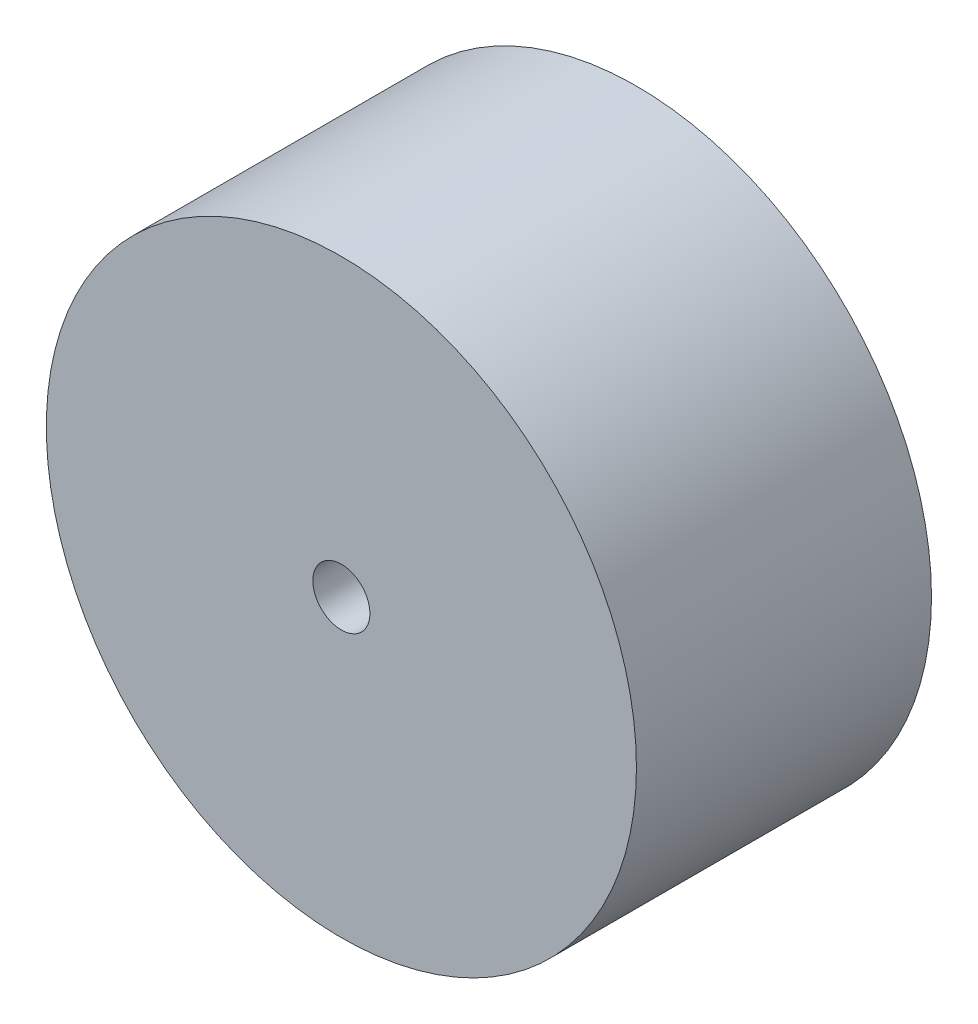
ISO-10303-21;
HEADER;
FILE_DESCRIPTION(('STEP AP214'),'2;1');
FILE_NAME('part.step','',(''),(''),'','','');
FILE_SCHEMA(('AUTOMOTIVE_DESIGN { 1 0 10303 214 1 1 1 1 }'));
ENDSEC;
DATA;
#1=APPLICATION_CONTEXT('core data for automotive mechanical design processes');
#2=APPLICATION_PROTOCOL_DEFINITION('international standard','automotive_design',2000,#1);
#3=PRODUCT_CONTEXT('',#1,'mechanical');
#4=PRODUCT('Part','Part','',(#3));
#5=PRODUCT_RELATED_PRODUCT_CATEGORY('part','',(#4));
#6=PRODUCT_DEFINITION_FORMATION('','',#4);
#7=PRODUCT_DEFINITION_CONTEXT('part definition',#1,'design');
#8=PRODUCT_DEFINITION('design','',#6,#7);
#9=PRODUCT_DEFINITION_SHAPE('','',#8);
#10=(LENGTH_UNIT() NAMED_UNIT(*) SI_UNIT(.MILLI.,.METRE.));
#11=(NAMED_UNIT(*) PLANE_ANGLE_UNIT() SI_UNIT($,.RADIAN.));
#12=(NAMED_UNIT(*) SI_UNIT($,.STERADIAN.) SOLID_ANGLE_UNIT());
#13=UNCERTAINTY_MEASURE_WITH_UNIT(LENGTH_MEASURE(1.E-05),#10,'distance_accuracy_value','');
#14=(GEOMETRIC_REPRESENTATION_CONTEXT(3) GLOBAL_UNCERTAINTY_ASSIGNED_CONTEXT((#13)) GLOBAL_UNIT_ASSIGNED_CONTEXT((#10,
#11,#12)) REPRESENTATION_CONTEXT('',''));
#15=CARTESIAN_POINT('',(0.,0.,0.));
#16=DIRECTION('',(0.,0.,1.));
#17=DIRECTION('',(1.,0.,0.));
#18=AXIS2_PLACEMENT_3D('',#15,#16,#17);
#19=CARTESIAN_POINT('',(0.,0.,15.));
#20=DIRECTION('',(0.,0.,1.));
#21=DIRECTION('',(1.,0.,0.));
#22=AXIS2_PLACEMENT_3D('',#19,#20,#21);
#23=PLANE('',#22);
#24=CARTESIAN_POINT('',(0.,0.,15.));
#25=DIRECTION('',(0.,0.,1.));
#26=DIRECTION('',(1.,0.,0.));
#27=AXIS2_PLACEMENT_3D('',#24,#25,#26);
#28=CIRCLE('',#27,15.);
#29=CARTESIAN_POINT('',(15.,0.,15.));
#30=VERTEX_POINT('',#29);
#31=EDGE_CURVE('E10',#30,#30,#28,.T.);
#32=ORIENTED_EDGE('',*,*,#31,.T.);
#33=EDGE_LOOP('',(#32));
#34=FACE_BOUND('',#33,.T.);
#35=CARTESIAN_POINT('',(0.,0.,15.));
#36=DIRECTION('',(0.,0.,1.));
#37=DIRECTION('',(1.,0.,0.));
#38=AXIS2_PLACEMENT_3D('',#35,#36,#37);
#39=CIRCLE('',#38,1.45);
#40=CARTESIAN_POINT('',(1.45,0.,15.));
#41=VERTEX_POINT('',#40);
#42=EDGE_CURVE('E50',#41,#41,#39,.T.);
#43=ORIENTED_EDGE('',*,*,#42,.F.);
#44=EDGE_LOOP('',(#43));
#45=FACE_BOUND('',#44,.T.);
#46=ADVANCED_FACE('F36',(#34,#45),#23,.T.);
#47=CARTESIAN_POINT('',(0.,0.,0.));
#48=DIRECTION('',(0.,0.,1.));
#49=DIRECTION('',(1.,0.,0.));
#50=AXIS2_PLACEMENT_3D('',#47,#48,#49);
#51=PLANE('',#50);
#52=CARTESIAN_POINT('',(0.,0.,0.));
#53=DIRECTION('',(0.,0.,1.));
#54=DIRECTION('',(1.,0.,0.));
#55=AXIS2_PLACEMENT_3D('',#52,#53,#54);
#56=CIRCLE('',#55,15.);
#57=CARTESIAN_POINT('',(15.,0.,0.));
#58=VERTEX_POINT('',#57);
#59=EDGE_CURVE('E40',#58,#58,#56,.T.);
#60=ORIENTED_EDGE('',*,*,#59,.F.);
#61=EDGE_LOOP('',(#60));
#62=FACE_BOUND('',#61,.T.);
#63=CARTESIAN_POINT('',(0.,0.,0.));
#64=DIRECTION('',(0.,0.,1.));
#65=DIRECTION('',(1.,0.,0.));
#66=AXIS2_PLACEMENT_3D('',#63,#64,#65);
#67=CIRCLE('',#66,1.45);
#68=CARTESIAN_POINT('',(1.45,0.,0.));
#69=VERTEX_POINT('',#68);
#70=EDGE_CURVE('E52',#69,#69,#67,.T.);
#71=ORIENTED_EDGE('',*,*,#70,.T.);
#72=EDGE_LOOP('',(#71));
#73=FACE_BOUND('',#72,.T.);
#74=ADVANCED_FACE('F63',(#62,#73),#51,.F.);
#75=CARTESIAN_POINT('',(0.,0.,15.));
#76=DIRECTION('',(0.,0.,-1.));
#77=DIRECTION('',(-1.,0.,0.));
#78=AXIS2_PLACEMENT_3D('',#75,#76,#77);
#79=CYLINDRICAL_SURFACE('',#78,15.);
#80=ORIENTED_EDGE('',*,*,#31,.F.);
#81=EDGE_LOOP('',(#80));
#82=FACE_BOUND('',#81,.T.);
#83=ORIENTED_EDGE('',*,*,#59,.T.);
#84=EDGE_LOOP('',(#83));
#85=FACE_BOUND('',#84,.T.);
#86=ADVANCED_FACE('F38',(#82,#85),#79,.T.);
#87=CARTESIAN_POINT('',(0.,0.,15.));
#88=DIRECTION('',(0.,0.,-1.));
#89=DIRECTION('',(-1.,0.,0.));
#90=AXIS2_PLACEMENT_3D('',#87,#88,#89);
#91=CYLINDRICAL_SURFACE('',#90,1.45);
#92=ORIENTED_EDGE('',*,*,#42,.T.);
#93=EDGE_LOOP('',(#92));
#94=FACE_BOUND('',#93,.T.);
#95=ORIENTED_EDGE('',*,*,#70,.F.);
#96=EDGE_LOOP('',(#95));
#97=FACE_BOUND('',#96,.T.);
#98=ADVANCED_FACE('F59',(#94,#97),#91,.F.);
#99=CLOSED_SHELL('',(#46,#74,#86,#98));
#100=MANIFOLD_SOLID_BREP('B2',#99);
#101=ADVANCED_BREP_SHAPE_REPRESENTATION('',(#18,#100),#14);
#102=SHAPE_DEFINITION_REPRESENTATION(#9,#101);
ENDSEC;
END-ISO-10303-21;
